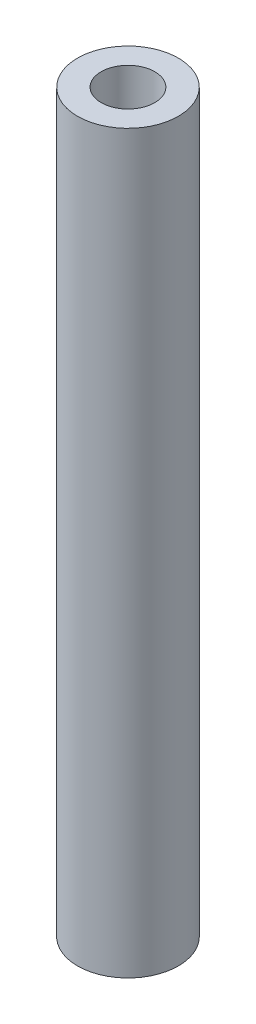
ISO-10303-21;
HEADER;
FILE_DESCRIPTION(('STEP AP214'),'2;1');
FILE_NAME('part.step','',(''),(''),'','','');
FILE_SCHEMA(('AUTOMOTIVE_DESIGN { 1 0 10303 214 1 1 1 1 }'));
ENDSEC;
DATA;
#1=APPLICATION_CONTEXT('core data for automotive mechanical design processes');
#2=APPLICATION_PROTOCOL_DEFINITION('international standard','automotive_design',2000,#1);
#3=PRODUCT_CONTEXT('',#1,'mechanical');
#4=PRODUCT('Part','Part','',(#3));
#5=PRODUCT_RELATED_PRODUCT_CATEGORY('part','',(#4));
#6=PRODUCT_DEFINITION_FORMATION('','',#4);
#7=PRODUCT_DEFINITION_CONTEXT('part definition',#1,'design');
#8=PRODUCT_DEFINITION('design','',#6,#7);
#9=PRODUCT_DEFINITION_SHAPE('','',#8);
#10=(LENGTH_UNIT() NAMED_UNIT(*) SI_UNIT(.MILLI.,.METRE.));
#11=(NAMED_UNIT(*) PLANE_ANGLE_UNIT() SI_UNIT($,.RADIAN.));
#12=(NAMED_UNIT(*) SI_UNIT($,.STERADIAN.) SOLID_ANGLE_UNIT());
#13=UNCERTAINTY_MEASURE_WITH_UNIT(LENGTH_MEASURE(1.E-05),#10,'distance_accuracy_value','');
#14=(GEOMETRIC_REPRESENTATION_CONTEXT(3) GLOBAL_UNCERTAINTY_ASSIGNED_CONTEXT((#13)) GLOBAL_UNIT_ASSIGNED_CONTEXT((#10,
#11,#12)) REPRESENTATION_CONTEXT('',''));
#15=CARTESIAN_POINT('',(0.,0.,0.));
#16=DIRECTION('',(0.,0.,1.));
#17=DIRECTION('',(1.,0.,0.));
#18=AXIS2_PLACEMENT_3D('',#15,#16,#17);
#19=CARTESIAN_POINT('',(0.,137.16,-1.11022302462516E-13));
#20=DIRECTION('',(0.,1.,0.));
#21=DIRECTION('',(0.,0.,1.));
#22=AXIS2_PLACEMENT_3D('',#19,#20,#21);
#23=PLANE('',#22);
#24=CARTESIAN_POINT('',(0.,137.16,-1.11022302462516E-13));
#25=DIRECTION('',(0.,1.,0.));
#26=DIRECTION('',(0.,0.,1.));
#27=AXIS2_PLACEMENT_3D('',#24,#25,#26);
#28=CIRCLE('',#27,9.398);
#29=CARTESIAN_POINT('',(0.,137.16,9.39799999999989));
#30=VERTEX_POINT('',#29);
#31=EDGE_CURVE('E10',#30,#30,#28,.T.);
#32=ORIENTED_EDGE('',*,*,#31,.T.);
#33=EDGE_LOOP('',(#32));
#34=FACE_BOUND('',#33,.T.);
#35=CARTESIAN_POINT('',(0.,137.16,-1.11022302462516E-13));
#36=DIRECTION('',(0.,1.,0.));
#37=DIRECTION('',(0.,0.,1.));
#38=AXIS2_PLACEMENT_3D('',#35,#36,#37);
#39=CIRCLE('',#38,5.);
#40=CARTESIAN_POINT('',(0.,137.16,4.99999999999989));
#41=VERTEX_POINT('',#40);
#42=EDGE_CURVE('E55',#41,#41,#39,.T.);
#43=ORIENTED_EDGE('',*,*,#42,.F.);
#44=EDGE_LOOP('',(#43));
#45=FACE_BOUND('',#44,.T.);
#46=ADVANCED_FACE('F41',(#34,#45),#23,.T.);
#47=CARTESIAN_POINT('',(0.,0.,0.));
#48=DIRECTION('',(0.,1.,0.));
#49=DIRECTION('',(0.,0.,1.));
#50=AXIS2_PLACEMENT_3D('',#47,#48,#49);
#51=PLANE('',#50);
#52=CARTESIAN_POINT('',(0.,0.,0.));
#53=DIRECTION('',(0.,1.,0.));
#54=DIRECTION('',(0.,0.,1.));
#55=AXIS2_PLACEMENT_3D('',#52,#53,#54);
#56=CIRCLE('',#55,9.398);
#57=CARTESIAN_POINT('',(0.,0.,9.398));
#58=VERTEX_POINT('',#57);
#59=EDGE_CURVE('E45',#58,#58,#56,.T.);
#60=ORIENTED_EDGE('',*,*,#59,.F.);
#61=EDGE_LOOP('',(#60));
#62=FACE_BOUND('',#61,.T.);
#63=CARTESIAN_POINT('',(0.,0.,0.));
#64=DIRECTION('',(0.,1.,0.));
#65=DIRECTION('',(0.,0.,1.));
#66=AXIS2_PLACEMENT_3D('',#63,#64,#65);
#67=CIRCLE('',#66,5.);
#68=CARTESIAN_POINT('',(0.,0.,5.));
#69=VERTEX_POINT('',#68);
#70=EDGE_CURVE('E57',#69,#69,#67,.T.);
#71=ORIENTED_EDGE('',*,*,#70,.T.);
#72=EDGE_LOOP('',(#71));
#73=FACE_BOUND('',#72,.T.);
#74=ADVANCED_FACE('F70',(#62,#73),#51,.F.);
#75=CARTESIAN_POINT('',(0.,137.16,-1.11022302462516E-13));
#76=DIRECTION('',(0.,-1.,0.));
#77=DIRECTION('',(0.,0.,-1.));
#78=AXIS2_PLACEMENT_3D('',#75,#76,#77);
#79=CYLINDRICAL_SURFACE('',#78,9.398);
#80=ORIENTED_EDGE('',*,*,#31,.F.);
#81=EDGE_LOOP('',(#80));
#82=FACE_BOUND('',#81,.T.);
#83=ORIENTED_EDGE('',*,*,#59,.T.);
#84=EDGE_LOOP('',(#83));
#85=FACE_BOUND('',#84,.T.);
#86=ADVANCED_FACE('F43',(#82,#85),#79,.T.);
#87=CARTESIAN_POINT('',(0.,137.16,-1.11022302462516E-13));
#88=DIRECTION('',(0.,-1.,0.));
#89=DIRECTION('',(0.,0.,-1.));
#90=AXIS2_PLACEMENT_3D('',#87,#88,#89);
#91=CYLINDRICAL_SURFACE('',#90,5.);
#92=ORIENTED_EDGE('',*,*,#42,.T.);
#93=EDGE_LOOP('',(#92));
#94=FACE_BOUND('',#93,.T.);
#95=ORIENTED_EDGE('',*,*,#70,.F.);
#96=EDGE_LOOP('',(#95));
#97=FACE_BOUND('',#96,.T.);
#98=ADVANCED_FACE('F66',(#94,#97),#91,.F.);
#99=CLOSED_SHELL('',(#46,#74,#86,#98));
#100=MANIFOLD_SOLID_BREP('B2',#99);
#101=ADVANCED_BREP_SHAPE_REPRESENTATION('',(#18,#100),#14);
#102=SHAPE_DEFINITION_REPRESENTATION(#9,#101);
ENDSEC;
END-ISO-10303-21;
